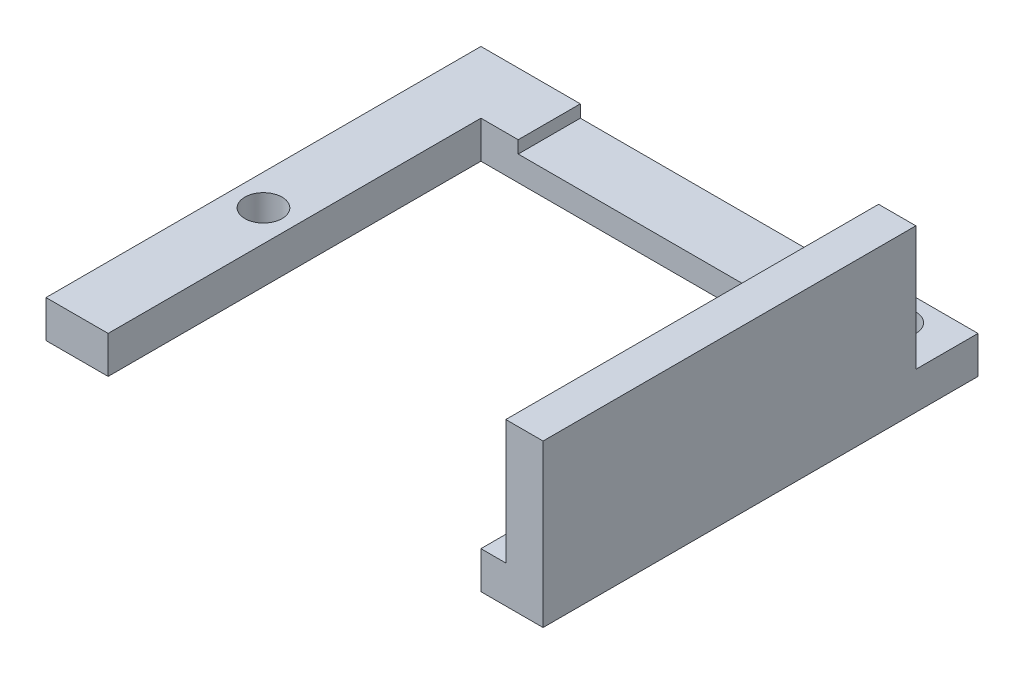
ISO-10303-21;
HEADER;
FILE_DESCRIPTION(('STEP AP214'),'2;1');
FILE_NAME('part.step','',(''),(''),'','','');
FILE_SCHEMA(('AUTOMOTIVE_DESIGN { 1 0 10303 214 1 1 1 1 }'));
ENDSEC;
DATA;
#1=APPLICATION_CONTEXT('core data for automotive mechanical design processes');
#2=APPLICATION_PROTOCOL_DEFINITION('international standard','automotive_design',2000,#1);
#3=PRODUCT_CONTEXT('',#1,'mechanical');
#4=PRODUCT('Part','Part','',(#3));
#5=PRODUCT_RELATED_PRODUCT_CATEGORY('part','',(#4));
#6=PRODUCT_DEFINITION_FORMATION('','',#4);
#7=PRODUCT_DEFINITION_CONTEXT('part definition',#1,'design');
#8=PRODUCT_DEFINITION('design','',#6,#7);
#9=PRODUCT_DEFINITION_SHAPE('','',#8);
#10=(LENGTH_UNIT() NAMED_UNIT(*) SI_UNIT(.MILLI.,.METRE.));
#11=(NAMED_UNIT(*) PLANE_ANGLE_UNIT() SI_UNIT($,.RADIAN.));
#12=(NAMED_UNIT(*) SI_UNIT($,.STERADIAN.) SOLID_ANGLE_UNIT());
#13=UNCERTAINTY_MEASURE_WITH_UNIT(LENGTH_MEASURE(1.E-05),#10,'distance_accuracy_value','');
#14=(GEOMETRIC_REPRESENTATION_CONTEXT(3) GLOBAL_UNCERTAINTY_ASSIGNED_CONTEXT((#13)) GLOBAL_UNIT_ASSIGNED_CONTEXT((#10,
#11,#12)) REPRESENTATION_CONTEXT('',''));
#15=CARTESIAN_POINT('',(0.,0.,0.));
#16=DIRECTION('',(0.,0.,1.));
#17=DIRECTION('',(1.,0.,0.));
#18=AXIS2_PLACEMENT_3D('',#15,#16,#17);
#19=CARTESIAN_POINT('',(0.,3.,0.));
#20=DIRECTION('',(0.,-1.,0.));
#21=DIRECTION('',(0.,0.,-1.));
#22=AXIS2_PLACEMENT_3D('',#19,#20,#21);
#23=PLANE('',#22);
#24=CARTESIAN_POINT('',(16.,3.,-20.6001386962552));
#25=DIRECTION('',(0.,1.,0.));
#26=DIRECTION('',(0.,0.,1.));
#27=AXIS2_PLACEMENT_3D('',#24,#25,#26);
#28=CIRCLE('',#27,1.5);
#29=CARTESIAN_POINT('',(16.,3.,-19.1001386962552));
#30=VERTEX_POINT('',#29);
#31=EDGE_CURVE('E436',#30,#30,#28,.T.);
#32=ORIENTED_EDGE('',*,*,#31,.F.);
#33=EDGE_LOOP('',(#32));
#34=FACE_BOUND('',#33,.T.);
#35=DIRECTION('',(-1.,0.,0.));
#36=VECTOR('',#35,1.);
#37=CARTESIAN_POINT('',(20.,3.,-18.1001386962552));
#38=LINE('',#37,#36);
#39=CARTESIAN_POINT('',(20.,3.,-18.1001386962552));
#40=VERTEX_POINT('',#39);
#41=CARTESIAN_POINT('',(17.,3.,-18.1001386962552));
#42=VERTEX_POINT('',#41);
#43=EDGE_CURVE('E167',#40,#42,#38,.T.);
#44=ORIENTED_EDGE('',*,*,#43,.F.);
#45=DIRECTION('',(0.,0.,-1.));
#46=VECTOR('',#45,1.);
#47=CARTESIAN_POINT('',(20.,3.,-23.1001386962552));
#48=LINE('',#47,#46);
#49=CARTESIAN_POINT('',(20.,3.,-23.1001386962552));
#50=VERTEX_POINT('',#49);
#51=EDGE_CURVE('E227',#40,#50,#48,.T.);
#52=ORIENTED_EDGE('',*,*,#51,.T.);
#53=DIRECTION('',(-1.,0.,0.));
#54=VECTOR('',#53,1.);
#55=CARTESIAN_POINT('',(20.,3.,-23.1001386962552));
#56=LINE('',#55,#54);
#57=CARTESIAN_POINT('',(12.,3.,-23.1001386962552));
#58=VERTEX_POINT('',#57);
#59=EDGE_CURVE('E230',#50,#58,#56,.T.);
#60=ORIENTED_EDGE('',*,*,#59,.T.);
#61=DIRECTION('',(0.,0.,-1.));
#62=VECTOR('',#61,1.);
#63=CARTESIAN_POINT('',(12.,3.,-23.1001386962552));
#64=LINE('',#63,#62);
#65=CARTESIAN_POINT('',(12.,3.,-18.1001386962552));
#66=VERTEX_POINT('',#65);
#67=EDGE_CURVE('E187',#66,#58,#64,.T.);
#68=ORIENTED_EDGE('',*,*,#67,.F.);
#69=DIRECTION('',(1.,0.,0.));
#70=VECTOR('',#69,1.);
#71=CARTESIAN_POINT('',(-15.,3.,-18.1001386962552));
#72=LINE('',#71,#70);
#73=CARTESIAN_POINT('',(15.,3.,-18.1001386962552));
#74=VERTEX_POINT('',#73);
#75=EDGE_CURVE('E220',#66,#74,#72,.T.);
#76=ORIENTED_EDGE('',*,*,#75,.T.);
#77=DIRECTION('',(0.,0.,1.));
#78=VECTOR('',#77,1.);
#79=CARTESIAN_POINT('',(15.,3.,-18.1001386962552));
#80=LINE('',#79,#78);
#81=CARTESIAN_POINT('',(15.,3.,11.8998613037448));
#82=VERTEX_POINT('',#81);
#83=EDGE_CURVE('E224',#74,#82,#80,.T.);
#84=ORIENTED_EDGE('',*,*,#83,.T.);
#85=DIRECTION('',(1.,0.,0.));
#86=VECTOR('',#85,1.);
#87=CARTESIAN_POINT('',(20.,3.,11.8998613037448));
#88=LINE('',#87,#86);
#89=CARTESIAN_POINT('',(17.,3.,11.8998613037448));
#90=VERTEX_POINT('',#89);
#91=EDGE_CURVE('E53',#82,#90,#88,.T.);
#92=ORIENTED_EDGE('',*,*,#91,.T.);
#93=DIRECTION('',(0.,0.,1.));
#94=VECTOR('',#93,1.);
#95=CARTESIAN_POINT('',(17.,3.,-18.1001386962552));
#96=LINE('',#95,#94);
#97=EDGE_CURVE('E48',#42,#90,#96,.T.);
#98=ORIENTED_EDGE('',*,*,#97,.F.);
#99=EDGE_LOOP('',(#44,#52,#60,#68,#76,#84,#92,#98));
#100=FACE_BOUND('',#99,.T.);
#101=ADVANCED_FACE('F33',(#34,#100),#23,.F.);
#102=CARTESIAN_POINT('',(-20.,3.,11.8998613037448));
#103=DIRECTION('',(0.,0.,-1.));
#104=DIRECTION('',(-1.,0.,0.));
#105=AXIS2_PLACEMENT_3D('',#102,#103,#104);
#106=PLANE('',#105);
#107=DIRECTION('',(1.,0.,0.));
#108=VECTOR('',#107,1.);
#109=CARTESIAN_POINT('',(-20.,0.,11.8998613037448));
#110=LINE('',#109,#108);
#111=CARTESIAN_POINT('',(-20.,0.,11.8998613037448));
#112=VERTEX_POINT('',#111);
#113=CARTESIAN_POINT('',(-15.,0.,11.8998613037448));
#114=VERTEX_POINT('',#113);
#115=EDGE_CURVE('E213',#112,#114,#110,.T.);
#116=ORIENTED_EDGE('',*,*,#115,.T.);
#117=DIRECTION('',(0.,-1.,0.));
#118=VECTOR('',#117,1.);
#119=CARTESIAN_POINT('',(-15.,3.,11.8998613037448));
#120=LINE('',#119,#118);
#121=CARTESIAN_POINT('',(-15.,3.,11.8998613037448));
#122=VERTEX_POINT('',#121);
#123=EDGE_CURVE('E11',#122,#114,#120,.T.);
#124=ORIENTED_EDGE('',*,*,#123,.F.);
#125=DIRECTION('',(1.,0.,0.));
#126=VECTOR('',#125,1.);
#127=CARTESIAN_POINT('',(-20.,3.,11.8998613037448));
#128=LINE('',#127,#126);
#129=CARTESIAN_POINT('',(-20.,3.,11.8998613037448));
#130=VERTEX_POINT('',#129);
#131=EDGE_CURVE('E214',#130,#122,#128,.T.);
#132=ORIENTED_EDGE('',*,*,#131,.F.);
#133=DIRECTION('',(0.,-1.,0.));
#134=VECTOR('',#133,1.);
#135=CARTESIAN_POINT('',(-20.,3.,11.8998613037448));
#136=LINE('',#135,#134);
#137=EDGE_CURVE('E235',#130,#112,#136,.T.);
#138=ORIENTED_EDGE('',*,*,#137,.T.);
#139=EDGE_LOOP('',(#116,#124,#132,#138));
#140=FACE_BOUND('',#139,.T.);
#141=ADVANCED_FACE('F35',(#140),#106,.F.);
#142=CARTESIAN_POINT('',(-15.,3.,-18.1001386962552));
#143=DIRECTION('',(-1.,0.,0.));
#144=DIRECTION('',(0.,0.,1.));
#145=AXIS2_PLACEMENT_3D('',#142,#143,#144);
#146=PLANE('',#145);
#147=DIRECTION('',(0.,0.,-1.));
#148=VECTOR('',#147,1.);
#149=CARTESIAN_POINT('',(-15.,0.,-18.1001386962552));
#150=LINE('',#149,#148);
#151=CARTESIAN_POINT('',(-15.,0.,-18.1001386962552));
#152=VERTEX_POINT('',#151);
#153=EDGE_CURVE('E238',#114,#152,#150,.T.);
#154=ORIENTED_EDGE('',*,*,#153,.T.);
#155=DIRECTION('',(0.,-1.,0.));
#156=VECTOR('',#155,1.);
#157=CARTESIAN_POINT('',(-15.,3.,-18.1001386962552));
#158=LINE('',#157,#156);
#159=CARTESIAN_POINT('',(-15.,3.,-18.1001386962552));
#160=VERTEX_POINT('',#159);
#161=EDGE_CURVE('E41',#160,#152,#158,.T.);
#162=ORIENTED_EDGE('',*,*,#161,.F.);
#163=DIRECTION('',(0.,0.,-1.));
#164=VECTOR('',#163,1.);
#165=CARTESIAN_POINT('',(-15.,3.,-18.1001386962552));
#166=LINE('',#165,#164);
#167=EDGE_CURVE('E217',#122,#160,#166,.T.);
#168=ORIENTED_EDGE('',*,*,#167,.F.);
#169=ORIENTED_EDGE('',*,*,#123,.T.);
#170=EDGE_LOOP('',(#154,#162,#168,#169));
#171=FACE_BOUND('',#170,.T.);
#172=ADVANCED_FACE('F304',(#171),#146,.F.);
#173=CARTESIAN_POINT('',(-15.,3.,-18.1001386962552));
#174=DIRECTION('',(0.,0.,-1.));
#175=DIRECTION('',(-1.,0.,0.));
#176=AXIS2_PLACEMENT_3D('',#173,#174,#175);
#177=PLANE('',#176);
#178=ORIENTED_EDGE('',*,*,#75,.F.);
#179=DIRECTION('',(0.,1.,0.));
#180=VECTOR('',#179,1.);
#181=CARTESIAN_POINT('',(12.,2.,-18.1001386962552));
#182=LINE('',#181,#180);
#183=CARTESIAN_POINT('',(12.,2.,-18.1001386962552));
#184=VERTEX_POINT('',#183);
#185=EDGE_CURVE('E202',#184,#66,#182,.T.);
#186=ORIENTED_EDGE('',*,*,#185,.F.);
#187=DIRECTION('',(1.,0.,0.));
#188=VECTOR('',#187,1.);
#189=CARTESIAN_POINT('',(12.,2.,-18.1001386962552));
#190=LINE('',#189,#188);
#191=CARTESIAN_POINT('',(-12.,2.,-18.1001386962552));
#192=VERTEX_POINT('',#191);
#193=EDGE_CURVE('E190',#192,#184,#190,.T.);
#194=ORIENTED_EDGE('',*,*,#193,.F.);
#195=DIRECTION('',(0.,1.,0.));
#196=VECTOR('',#195,1.);
#197=CARTESIAN_POINT('',(-12.,2.,-18.1001386962552));
#198=LINE('',#197,#196);
#199=CARTESIAN_POINT('',(-12.,3.,-18.1001386962552));
#200=VERTEX_POINT('',#199);
#201=EDGE_CURVE('E204',#192,#200,#198,.T.);
#202=ORIENTED_EDGE('',*,*,#201,.T.);
#203=EDGE_CURVE('E221',#160,#200,#72,.T.);
#204=ORIENTED_EDGE('',*,*,#203,.F.);
#205=ORIENTED_EDGE('',*,*,#161,.T.);
#206=DIRECTION('',(1.,0.,0.));
#207=VECTOR('',#206,1.);
#208=CARTESIAN_POINT('',(-15.,0.,-18.1001386962552));
#209=LINE('',#208,#207);
#210=CARTESIAN_POINT('',(15.,0.,-18.1001386962552));
#211=VERTEX_POINT('',#210);
#212=EDGE_CURVE('E240',#152,#211,#209,.T.);
#213=ORIENTED_EDGE('',*,*,#212,.T.);
#214=DIRECTION('',(0.,-1.,0.));
#215=VECTOR('',#214,1.);
#216=CARTESIAN_POINT('',(15.,3.,-18.1001386962552));
#217=LINE('',#216,#215);
#218=EDGE_CURVE('E258',#74,#211,#217,.T.);
#219=ORIENTED_EDGE('',*,*,#218,.F.);
#220=EDGE_LOOP('',(#178,#186,#194,#202,#204,#205,#213,#219));
#221=FACE_BOUND('',#220,.T.);
#222=ADVANCED_FACE('F266',(#221),#177,.F.);
#223=CARTESIAN_POINT('',(15.,3.,-18.1001386962552));
#224=DIRECTION('',(1.,0.,0.));
#225=DIRECTION('',(0.,0.,-1.));
#226=AXIS2_PLACEMENT_3D('',#223,#224,#225);
#227=PLANE('',#226);
#228=DIRECTION('',(0.,0.,1.));
#229=VECTOR('',#228,1.);
#230=CARTESIAN_POINT('',(15.,0.,-18.1001386962552));
#231=LINE('',#230,#229);
#232=CARTESIAN_POINT('',(15.,0.,11.8998613037448));
#233=VERTEX_POINT('',#232);
#234=EDGE_CURVE('E242',#211,#233,#231,.T.);
#235=ORIENTED_EDGE('',*,*,#234,.T.);
#236=DIRECTION('',(0.,-1.,0.));
#237=VECTOR('',#236,1.);
#238=CARTESIAN_POINT('',(15.,3.,11.8998613037448));
#239=LINE('',#238,#237);
#240=EDGE_CURVE('E150',#82,#233,#239,.T.);
#241=ORIENTED_EDGE('',*,*,#240,.F.);
#242=ORIENTED_EDGE('',*,*,#83,.F.);
#243=ORIENTED_EDGE('',*,*,#218,.T.);
#244=EDGE_LOOP('',(#235,#241,#242,#243));
#245=FACE_BOUND('',#244,.T.);
#246=ADVANCED_FACE('F275',(#245),#227,.F.);
#247=CARTESIAN_POINT('',(20.,3.,11.8998613037448));
#248=DIRECTION('',(0.,0.,-1.));
#249=DIRECTION('',(-1.,0.,0.));
#250=AXIS2_PLACEMENT_3D('',#247,#248,#249);
#251=PLANE('',#250);
#252=DIRECTION('',(1.,0.,0.));
#253=VECTOR('',#252,1.);
#254=CARTESIAN_POINT('',(20.,0.,11.8998613037448));
#255=LINE('',#254,#253);
#256=CARTESIAN_POINT('',(20.,0.,11.8998613037448));
#257=VERTEX_POINT('',#256);
#258=EDGE_CURVE('E147',#233,#257,#255,.T.);
#259=ORIENTED_EDGE('',*,*,#258,.T.);
#260=DIRECTION('',(0.,-1.,0.));
#261=VECTOR('',#260,1.);
#262=CARTESIAN_POINT('',(20.,3.,11.8998613037448));
#263=LINE('',#262,#261);
#264=CARTESIAN_POINT('',(20.,13.,11.8998613037448));
#265=VERTEX_POINT('',#264);
#266=EDGE_CURVE('E139',#265,#257,#263,.T.);
#267=ORIENTED_EDGE('',*,*,#266,.F.);
#268=DIRECTION('',(1.,0.,0.));
#269=VECTOR('',#268,1.);
#270=CARTESIAN_POINT('',(17.,13.,11.8998613037448));
#271=LINE('',#270,#269);
#272=CARTESIAN_POINT('',(17.,13.,11.8998613037448));
#273=VERTEX_POINT('',#272);
#274=EDGE_CURVE('E144',#273,#265,#271,.T.);
#275=ORIENTED_EDGE('',*,*,#274,.F.);
#276=DIRECTION('',(0.,-1.,0.));
#277=VECTOR('',#276,1.);
#278=CARTESIAN_POINT('',(17.,13.,11.8998613037448));
#279=LINE('',#278,#277);
#280=EDGE_CURVE('E175',#273,#90,#279,.T.);
#281=ORIENTED_EDGE('',*,*,#280,.T.);
#282=ORIENTED_EDGE('',*,*,#91,.F.);
#283=ORIENTED_EDGE('',*,*,#240,.T.);
#284=EDGE_LOOP('',(#259,#267,#275,#281,#282,#283));
#285=FACE_BOUND('',#284,.T.);
#286=ADVANCED_FACE('F141',(#285),#251,.F.);
#287=CARTESIAN_POINT('',(20.,3.,-23.1001386962552));
#288=DIRECTION('',(-1.,0.,0.));
#289=DIRECTION('',(0.,0.,1.));
#290=AXIS2_PLACEMENT_3D('',#287,#288,#289);
#291=PLANE('',#290);
#292=DIRECTION('',(0.,0.,-1.));
#293=VECTOR('',#292,1.);
#294=CARTESIAN_POINT('',(20.,0.,-23.1001386962552));
#295=LINE('',#294,#293);
#296=CARTESIAN_POINT('',(20.,0.,-23.1001386962552));
#297=VERTEX_POINT('',#296);
#298=EDGE_CURVE('E245',#257,#297,#295,.T.);
#299=ORIENTED_EDGE('',*,*,#298,.T.);
#300=DIRECTION('',(0.,-1.,0.));
#301=VECTOR('',#300,1.);
#302=CARTESIAN_POINT('',(20.,3.,-23.1001386962552));
#303=LINE('',#302,#301);
#304=EDGE_CURVE('E151',#50,#297,#303,.T.);
#305=ORIENTED_EDGE('',*,*,#304,.F.);
#306=ORIENTED_EDGE('',*,*,#51,.F.);
#307=DIRECTION('',(0.,-1.,0.));
#308=VECTOR('',#307,1.);
#309=CARTESIAN_POINT('',(20.,13.,-18.1001386962552));
#310=LINE('',#309,#308);
#311=CARTESIAN_POINT('',(20.,13.,-18.1001386962552));
#312=VERTEX_POINT('',#311);
#313=EDGE_CURVE('E157',#312,#40,#310,.T.);
#314=ORIENTED_EDGE('',*,*,#313,.F.);
#315=DIRECTION('',(0.,0.,-1.));
#316=VECTOR('',#315,1.);
#317=CARTESIAN_POINT('',(20.,13.,11.8998613037448));
#318=LINE('',#317,#316);
#319=EDGE_CURVE('E154',#265,#312,#318,.T.);
#320=ORIENTED_EDGE('',*,*,#319,.F.);
#321=ORIENTED_EDGE('',*,*,#266,.T.);
#322=EDGE_LOOP('',(#299,#305,#306,#314,#320,#321));
#323=FACE_BOUND('',#322,.T.);
#324=ADVANCED_FACE('F155',(#323),#291,.F.);
#325=CARTESIAN_POINT('',(20.,3.,-23.1001386962552));
#326=DIRECTION('',(0.,0.,1.));
#327=DIRECTION('',(1.,0.,0.));
#328=AXIS2_PLACEMENT_3D('',#325,#326,#327);
#329=PLANE('',#328);
#330=DIRECTION('',(-1.,0.,0.));
#331=VECTOR('',#330,1.);
#332=CARTESIAN_POINT('',(-12.,2.,-23.1001386962552));
#333=LINE('',#332,#331);
#334=CARTESIAN_POINT('',(12.,2.,-23.1001386962552));
#335=VERTEX_POINT('',#334);
#336=CARTESIAN_POINT('',(-12.,2.,-23.1001386962552));
#337=VERTEX_POINT('',#336);
#338=EDGE_CURVE('E183',#335,#337,#333,.T.);
#339=ORIENTED_EDGE('',*,*,#338,.F.);
#340=DIRECTION('',(0.,1.,0.));
#341=VECTOR('',#340,1.);
#342=CARTESIAN_POINT('',(12.,2.,-23.1001386962552));
#343=LINE('',#342,#341);
#344=EDGE_CURVE('E198',#335,#58,#343,.T.);
#345=ORIENTED_EDGE('',*,*,#344,.T.);
#346=ORIENTED_EDGE('',*,*,#59,.F.);
#347=ORIENTED_EDGE('',*,*,#304,.T.);
#348=DIRECTION('',(-1.,0.,0.));
#349=VECTOR('',#348,1.);
#350=CARTESIAN_POINT('',(20.,0.,-23.1001386962552));
#351=LINE('',#350,#349);
#352=CARTESIAN_POINT('',(-20.,0.,-23.1001386962552));
#353=VERTEX_POINT('',#352);
#354=EDGE_CURVE('E247',#297,#353,#351,.T.);
#355=ORIENTED_EDGE('',*,*,#354,.T.);
#356=DIRECTION('',(0.,-1.,0.));
#357=VECTOR('',#356,1.);
#358=CARTESIAN_POINT('',(-20.,3.,-23.1001386962552));
#359=LINE('',#358,#357);
#360=CARTESIAN_POINT('',(-20.,3.,-23.1001386962552));
#361=VERTEX_POINT('',#360);
#362=EDGE_CURVE('E252',#361,#353,#359,.T.);
#363=ORIENTED_EDGE('',*,*,#362,.F.);
#364=CARTESIAN_POINT('',(-12.,3.,-23.1001386962552));
#365=VERTEX_POINT('',#364);
#366=EDGE_CURVE('E229',#365,#361,#56,.T.);
#367=ORIENTED_EDGE('',*,*,#366,.F.);
#368=DIRECTION('',(0.,1.,0.));
#369=VECTOR('',#368,1.);
#370=CARTESIAN_POINT('',(-12.,2.,-23.1001386962552));
#371=LINE('',#370,#369);
#372=EDGE_CURVE('E195',#337,#365,#371,.T.);
#373=ORIENTED_EDGE('',*,*,#372,.F.);
#374=EDGE_LOOP('',(#339,#345,#346,#347,#355,#363,#367,#373));
#375=FACE_BOUND('',#374,.T.);
#376=ADVANCED_FACE('F288',(#375),#329,.F.);
#377=CARTESIAN_POINT('',(-20.,3.,-23.1001386962552));
#378=DIRECTION('',(1.,0.,0.));
#379=DIRECTION('',(0.,0.,-1.));
#380=AXIS2_PLACEMENT_3D('',#377,#378,#379);
#381=PLANE('',#380);
#382=DIRECTION('',(0.,0.,1.));
#383=VECTOR('',#382,1.);
#384=CARTESIAN_POINT('',(-20.,0.,-23.1001386962552));
#385=LINE('',#384,#383);
#386=EDGE_CURVE('E218',#353,#112,#385,.T.);
#387=ORIENTED_EDGE('',*,*,#386,.T.);
#388=ORIENTED_EDGE('',*,*,#137,.F.);
#389=DIRECTION('',(0.,0.,1.));
#390=VECTOR('',#389,1.);
#391=CARTESIAN_POINT('',(-20.,3.,-23.1001386962552));
#392=LINE('',#391,#390);
#393=EDGE_CURVE('E233',#361,#130,#392,.T.);
#394=ORIENTED_EDGE('',*,*,#393,.F.);
#395=ORIENTED_EDGE('',*,*,#362,.T.);
#396=EDGE_LOOP('',(#387,#388,#394,#395));
#397=FACE_BOUND('',#396,.T.);
#398=ADVANCED_FACE('F309',(#397),#381,.F.);
#399=CARTESIAN_POINT('',(-17.5,3.,-3.10013869625519));
#400=DIRECTION('',(0.,1.,0.));
#401=DIRECTION('',(0.,0.,-1.));
#402=AXIS2_PLACEMENT_3D('',#399,#400,#401);
#403=CIRCLE('',#402,1.5);
#404=CARTESIAN_POINT('',(-17.5,3.,-4.6001386962552));
#405=VERTEX_POINT('',#404);
#406=EDGE_CURVE('E201',#405,#405,#403,.T.);
#407=ORIENTED_EDGE('',*,*,#406,.F.);
#408=EDGE_LOOP('',(#407));
#409=FACE_BOUND('',#408,.T.);
#410=ORIENTED_EDGE('',*,*,#203,.T.);
#411=DIRECTION('',(0.,0.,1.));
#412=VECTOR('',#411,1.);
#413=CARTESIAN_POINT('',(-12.,3.,-18.1001386962552));
#414=LINE('',#413,#412);
#415=EDGE_CURVE('E182',#365,#200,#414,.T.);
#416=ORIENTED_EDGE('',*,*,#415,.F.);
#417=ORIENTED_EDGE('',*,*,#366,.T.);
#418=ORIENTED_EDGE('',*,*,#393,.T.);
#419=ORIENTED_EDGE('',*,*,#131,.T.);
#420=ORIENTED_EDGE('',*,*,#167,.T.);
#421=EDGE_LOOP('',(#410,#416,#417,#418,#419,#420));
#422=FACE_BOUND('',#421,.T.);
#423=ADVANCED_FACE('F300',(#409,#422),#23,.F.);
#424=CARTESIAN_POINT('',(0.,0.,0.));
#425=DIRECTION('',(0.,-1.,0.));
#426=DIRECTION('',(0.,0.,-1.));
#427=AXIS2_PLACEMENT_3D('',#424,#425,#426);
#428=PLANE('',#427);
#429=CARTESIAN_POINT('',(16.,0.,-20.6001386962552));
#430=DIRECTION('',(0.,-1.,0.));
#431=DIRECTION('',(0.,0.,-1.));
#432=AXIS2_PLACEMENT_3D('',#429,#430,#431);
#433=CIRCLE('',#432,1.5);
#434=CARTESIAN_POINT('',(16.,0.,-22.1001386962552));
#435=VERTEX_POINT('',#434);
#436=EDGE_CURVE('E170',#435,#435,#433,.F.);
#437=ORIENTED_EDGE('',*,*,#436,.T.);
#438=EDGE_LOOP('',(#437));
#439=FACE_BOUND('',#438,.T.);
#440=CARTESIAN_POINT('',(-17.5,0.,-3.10013869625519));
#441=DIRECTION('',(0.,-1.,0.));
#442=DIRECTION('',(0.,0.,-1.));
#443=AXIS2_PLACEMENT_3D('',#440,#441,#442);
#444=CIRCLE('',#443,1.5);
#445=CARTESIAN_POINT('',(-17.5,0.,-4.6001386962552));
#446=VERTEX_POINT('',#445);
#447=EDGE_CURVE('E210',#446,#446,#444,.F.);
#448=ORIENTED_EDGE('',*,*,#447,.T.);
#449=EDGE_LOOP('',(#448));
#450=FACE_BOUND('',#449,.T.);
#451=ORIENTED_EDGE('',*,*,#115,.F.);
#452=ORIENTED_EDGE('',*,*,#386,.F.);
#453=ORIENTED_EDGE('',*,*,#354,.F.);
#454=ORIENTED_EDGE('',*,*,#298,.F.);
#455=ORIENTED_EDGE('',*,*,#258,.F.);
#456=ORIENTED_EDGE('',*,*,#234,.F.);
#457=ORIENTED_EDGE('',*,*,#212,.F.);
#458=ORIENTED_EDGE('',*,*,#153,.F.);
#459=EDGE_LOOP('',(#451,#452,#453,#454,#455,#456,#457,#458));
#460=FACE_BOUND('',#459,.T.);
#461=ADVANCED_FACE('F272',(#439,#450,#460),#428,.T.);
#462=CARTESIAN_POINT('',(-17.5,-4.24264068711929,-3.10013869625519));
#463=DIRECTION('',(0.,1.,0.));
#464=DIRECTION('',(0.,0.,1.));
#465=AXIS2_PLACEMENT_3D('',#462,#463,#464);
#466=CYLINDRICAL_SURFACE('',#465,1.5);
#467=ORIENTED_EDGE('',*,*,#406,.T.);
#468=EDGE_LOOP('',(#467));
#469=FACE_BOUND('',#468,.T.);
#470=ORIENTED_EDGE('',*,*,#447,.F.);
#471=EDGE_LOOP('',(#470));
#472=FACE_BOUND('',#471,.T.);
#473=ADVANCED_FACE('F320',(#469,#472),#466,.F.);
#474=CARTESIAN_POINT('',(12.,2.,-23.1001386962552));
#475=DIRECTION('',(1.,0.,0.));
#476=DIRECTION('',(0.,0.,-1.));
#477=AXIS2_PLACEMENT_3D('',#474,#475,#476);
#478=PLANE('',#477);
#479=ORIENTED_EDGE('',*,*,#67,.T.);
#480=ORIENTED_EDGE('',*,*,#344,.F.);
#481=DIRECTION('',(0.,0.,-1.));
#482=VECTOR('',#481,1.);
#483=CARTESIAN_POINT('',(12.,2.,-23.1001386962552));
#484=LINE('',#483,#482);
#485=EDGE_CURVE('E192',#184,#335,#484,.T.);
#486=ORIENTED_EDGE('',*,*,#485,.F.);
#487=ORIENTED_EDGE('',*,*,#185,.T.);
#488=EDGE_LOOP('',(#479,#480,#486,#487));
#489=FACE_BOUND('',#488,.T.);
#490=ADVANCED_FACE('F292',(#489),#478,.F.);
#491=CARTESIAN_POINT('',(-12.,2.,-18.1001386962552));
#492=DIRECTION('',(-1.,0.,0.));
#493=DIRECTION('',(0.,0.,1.));
#494=AXIS2_PLACEMENT_3D('',#491,#492,#493);
#495=PLANE('',#494);
#496=ORIENTED_EDGE('',*,*,#415,.T.);
#497=ORIENTED_EDGE('',*,*,#201,.F.);
#498=DIRECTION('',(0.,0.,1.));
#499=VECTOR('',#498,1.);
#500=CARTESIAN_POINT('',(-12.,2.,-18.1001386962552));
#501=LINE('',#500,#499);
#502=EDGE_CURVE('E186',#337,#192,#501,.T.);
#503=ORIENTED_EDGE('',*,*,#502,.F.);
#504=ORIENTED_EDGE('',*,*,#372,.T.);
#505=EDGE_LOOP('',(#496,#497,#503,#504));
#506=FACE_BOUND('',#505,.T.);
#507=ADVANCED_FACE('F312',(#506),#495,.F.);
#508=CARTESIAN_POINT('',(0.,2.,0.));
#509=DIRECTION('',(0.,-1.,0.));
#510=DIRECTION('',(0.,0.,-1.));
#511=AXIS2_PLACEMENT_3D('',#508,#509,#510);
#512=PLANE('',#511);
#513=ORIENTED_EDGE('',*,*,#338,.T.);
#514=ORIENTED_EDGE('',*,*,#502,.T.);
#515=ORIENTED_EDGE('',*,*,#193,.T.);
#516=ORIENTED_EDGE('',*,*,#485,.T.);
#517=EDGE_LOOP('',(#513,#514,#515,#516));
#518=FACE_BOUND('',#517,.T.);
#519=ADVANCED_FACE('F295',(#518),#512,.F.);
#520=CARTESIAN_POINT('',(20.,13.,-18.1001386962552));
#521=DIRECTION('',(0.,0.,1.));
#522=DIRECTION('',(1.,0.,0.));
#523=AXIS2_PLACEMENT_3D('',#520,#521,#522);
#524=PLANE('',#523);
#525=ORIENTED_EDGE('',*,*,#43,.T.);
#526=DIRECTION('',(0.,-1.,0.));
#527=VECTOR('',#526,1.);
#528=CARTESIAN_POINT('',(17.,13.,-18.1001386962552));
#529=LINE('',#528,#527);
#530=CARTESIAN_POINT('',(17.,13.,-18.1001386962552));
#531=VERTEX_POINT('',#530);
#532=EDGE_CURVE('E178',#531,#42,#529,.T.);
#533=ORIENTED_EDGE('',*,*,#532,.F.);
#534=DIRECTION('',(-1.,0.,0.));
#535=VECTOR('',#534,1.);
#536=CARTESIAN_POINT('',(20.,13.,-18.1001386962552));
#537=LINE('',#536,#535);
#538=EDGE_CURVE('E160',#312,#531,#537,.T.);
#539=ORIENTED_EDGE('',*,*,#538,.F.);
#540=ORIENTED_EDGE('',*,*,#313,.T.);
#541=EDGE_LOOP('',(#525,#533,#539,#540));
#542=FACE_BOUND('',#541,.T.);
#543=ADVANCED_FACE('F281',(#542),#524,.F.);
#544=CARTESIAN_POINT('',(17.,13.,-18.1001386962552));
#545=DIRECTION('',(1.,0.,0.));
#546=DIRECTION('',(0.,0.,-1.));
#547=AXIS2_PLACEMENT_3D('',#544,#545,#546);
#548=PLANE('',#547);
#549=ORIENTED_EDGE('',*,*,#97,.T.);
#550=ORIENTED_EDGE('',*,*,#280,.F.);
#551=DIRECTION('',(0.,0.,1.));
#552=VECTOR('',#551,1.);
#553=CARTESIAN_POINT('',(17.,13.,-18.1001386962552));
#554=LINE('',#553,#552);
#555=EDGE_CURVE('E164',#531,#273,#554,.T.);
#556=ORIENTED_EDGE('',*,*,#555,.F.);
#557=ORIENTED_EDGE('',*,*,#532,.T.);
#558=EDGE_LOOP('',(#549,#550,#556,#557));
#559=FACE_BOUND('',#558,.T.);
#560=ADVANCED_FACE('F278',(#559),#548,.F.);
#561=CARTESIAN_POINT('',(0.,13.,0.));
#562=DIRECTION('',(0.,1.,0.));
#563=DIRECTION('',(0.,0.,1.));
#564=AXIS2_PLACEMENT_3D('',#561,#562,#563);
#565=PLANE('',#564);
#566=ORIENTED_EDGE('',*,*,#274,.T.);
#567=ORIENTED_EDGE('',*,*,#319,.T.);
#568=ORIENTED_EDGE('',*,*,#538,.T.);
#569=ORIENTED_EDGE('',*,*,#555,.T.);
#570=EDGE_LOOP('',(#566,#567,#568,#569));
#571=FACE_BOUND('',#570,.T.);
#572=ADVANCED_FACE('F162',(#571),#565,.T.);
#573=CARTESIAN_POINT('',(16.,-4.24264068711929,-20.6001386962552));
#574=DIRECTION('',(0.,1.,0.));
#575=DIRECTION('',(0.,0.,1.));
#576=AXIS2_PLACEMENT_3D('',#573,#574,#575);
#577=CYLINDRICAL_SURFACE('',#576,1.5);
#578=ORIENTED_EDGE('',*,*,#31,.T.);
#579=EDGE_LOOP('',(#578));
#580=FACE_BOUND('',#579,.T.);
#581=ORIENTED_EDGE('',*,*,#436,.F.);
#582=EDGE_LOOP('',(#581));
#583=FACE_BOUND('',#582,.T.);
#584=ADVANCED_FACE('F413',(#580,#583),#577,.F.);
#585=CLOSED_SHELL('',(#101,#141,#172,#222,#246,#286,#324,#376,#398,#423,#461,#473,#490,#507,
#519,#543,#560,#572,#584));
#586=MANIFOLD_SOLID_BREP('B2',#585);
#587=ADVANCED_BREP_SHAPE_REPRESENTATION('',(#18,#586),#14);
#588=SHAPE_DEFINITION_REPRESENTATION(#9,#587);
ENDSEC;
END-ISO-10303-21;
